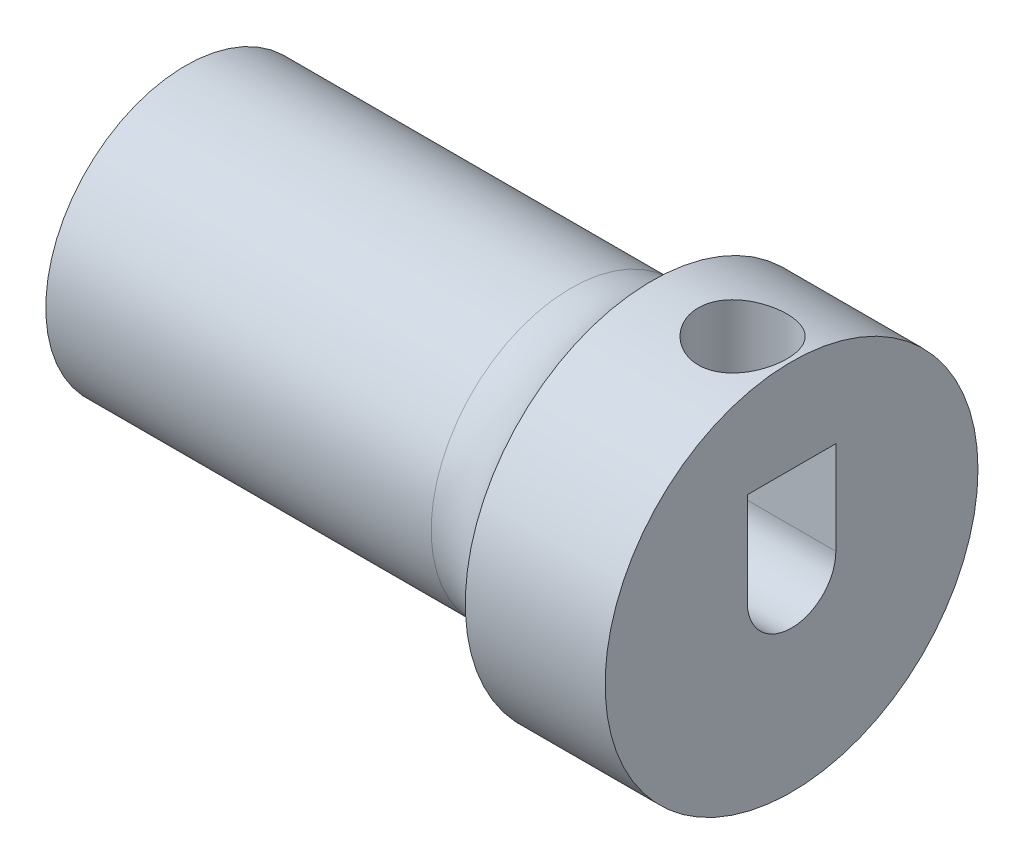
ISO-10303-21;
HEADER;
FILE_DESCRIPTION(('STEP AP214'),'2;1');
FILE_NAME('part.step','',(''),(''),'','','');
FILE_SCHEMA(('AUTOMOTIVE_DESIGN { 1 0 10303 214 1 1 1 1 }'));
ENDSEC;
DATA;
#1=APPLICATION_CONTEXT('core data for automotive mechanical design processes');
#2=APPLICATION_PROTOCOL_DEFINITION('international standard','automotive_design',2000,#1);
#3=PRODUCT_CONTEXT('',#1,'mechanical');
#4=PRODUCT('Part','Part','',(#3));
#5=PRODUCT_RELATED_PRODUCT_CATEGORY('part','',(#4));
#6=PRODUCT_DEFINITION_FORMATION('','',#4);
#7=PRODUCT_DEFINITION_CONTEXT('part definition',#1,'design');
#8=PRODUCT_DEFINITION('design','',#6,#7);
#9=PRODUCT_DEFINITION_SHAPE('','',#8);
#10=(LENGTH_UNIT() NAMED_UNIT(*) SI_UNIT(.MILLI.,.METRE.));
#11=(NAMED_UNIT(*) PLANE_ANGLE_UNIT() SI_UNIT($,.RADIAN.));
#12=(NAMED_UNIT(*) SI_UNIT($,.STERADIAN.) SOLID_ANGLE_UNIT());
#13=UNCERTAINTY_MEASURE_WITH_UNIT(LENGTH_MEASURE(1.E-05),#10,'distance_accuracy_value','');
#14=(GEOMETRIC_REPRESENTATION_CONTEXT(3) GLOBAL_UNCERTAINTY_ASSIGNED_CONTEXT((#13)) GLOBAL_UNIT_ASSIGNED_CONTEXT((#10,
#11,#12)) REPRESENTATION_CONTEXT('',''));
#15=CARTESIAN_POINT('',(0.,0.,0.));
#16=DIRECTION('',(0.,0.,1.));
#17=DIRECTION('',(1.,0.,0.));
#18=AXIS2_PLACEMENT_3D('',#15,#16,#17);
#19=CARTESIAN_POINT('',(11.,2.,0.));
#20=DIRECTION('',(0.,-1.,0.));
#21=DIRECTION('',(0.,0.,-1.));
#22=AXIS2_PLACEMENT_3D('',#19,#20,#21);
#23=PLANE('',#22);
#24=CARTESIAN_POINT('',(11.95,2.,0.));
#25=DIRECTION('',(0.,-1.,0.));
#26=DIRECTION('',(0.,0.,-1.));
#27=AXIS2_PLACEMENT_3D('',#24,#25,#26);
#28=CIRCLE('',#27,0.949999999999999);
#29=CARTESIAN_POINT('',(11.95,2.,-0.95));
#30=VERTEX_POINT('',#29);
#31=CARTESIAN_POINT('',(11.95,2.,0.949999999999999));
#32=VERTEX_POINT('',#31);
#33=EDGE_CURVE('E98',#30,#32,#28,.T.);
#34=ORIENTED_EDGE('',*,*,#33,.F.);
#35=DIRECTION('',(1.,0.,0.));
#36=VECTOR('',#35,1.);
#37=CARTESIAN_POINT('',(11.,2.,-0.95));
#38=LINE('',#37,#36);
#39=CARTESIAN_POINT('',(13.,2.,-0.95));
#40=VERTEX_POINT('',#39);
#41=EDGE_CURVE('E107',#30,#40,#38,.T.);
#42=ORIENTED_EDGE('',*,*,#41,.T.);
#43=DIRECTION('',(0.,0.,-1.));
#44=VECTOR('',#43,1.);
#45=CARTESIAN_POINT('',(13.,2.,0.));
#46=LINE('',#45,#44);
#47=CARTESIAN_POINT('',(13.,2.,0.95));
#48=VERTEX_POINT('',#47);
#49=EDGE_CURVE('E237',#48,#40,#46,.T.);
#50=ORIENTED_EDGE('',*,*,#49,.F.);
#51=DIRECTION('',(1.,0.,0.));
#52=VECTOR('',#51,1.);
#53=CARTESIAN_POINT('',(11.,2.,0.95));
#54=LINE('',#53,#52);
#55=EDGE_CURVE('E109',#32,#48,#54,.T.);
#56=ORIENTED_EDGE('',*,*,#55,.F.);
#57=EDGE_LOOP('',(#34,#42,#50,#56));
#58=FACE_BOUND('',#57,.T.);
#59=ADVANCED_FACE('F35',(#58),#23,.T.);
#60=CARTESIAN_POINT('',(11.,2.,0.));
#61=VERTEX_POINT('',#60);
#62=EDGE_CURVE('E50',#32,#61,#28,.T.);
#63=ORIENTED_EDGE('',*,*,#62,.F.);
#64=CARTESIAN_POINT('',(11.,2.,0.95));
#65=VERTEX_POINT('',#64);
#66=EDGE_CURVE('E125',#65,#32,#54,.T.);
#67=ORIENTED_EDGE('',*,*,#66,.F.);
#68=DIRECTION('',(0.,0.,-1.));
#69=VECTOR('',#68,1.);
#70=CARTESIAN_POINT('',(11.,2.,0.));
#71=LINE('',#70,#69);
#72=EDGE_CURVE('E132',#65,#61,#71,.T.);
#73=ORIENTED_EDGE('',*,*,#72,.T.);
#74=EDGE_LOOP('',(#63,#67,#73));
#75=FACE_BOUND('',#74,.T.);
#76=ADVANCED_FACE('F180',(#75),#23,.T.);
#77=CARTESIAN_POINT('',(13.,0.,0.));
#78=DIRECTION('',(1.,0.,0.));
#79=DIRECTION('',(0.,0.,-1.));
#80=AXIS2_PLACEMENT_3D('',#77,#78,#79);
#81=PLANE('',#80);
#82=CARTESIAN_POINT('',(13.,0.,0.));
#83=DIRECTION('',(1.,0.,0.));
#84=DIRECTION('',(0.,0.,-1.));
#85=AXIS2_PLACEMENT_3D('',#82,#83,#84);
#86=CIRCLE('',#85,4.);
#87=CARTESIAN_POINT('',(13.,0.,-4.));
#88=VERTEX_POINT('',#87);
#89=EDGE_CURVE('E133',#88,#88,#86,.T.);
#90=ORIENTED_EDGE('',*,*,#89,.T.);
#91=EDGE_LOOP('',(#90));
#92=FACE_BOUND('',#91,.T.);
#93=CARTESIAN_POINT('',(13.,0.,0.));
#94=DIRECTION('',(1.,0.,0.));
#95=DIRECTION('',(0.,0.,-1.));
#96=AXIS2_PLACEMENT_3D('',#93,#94,#95);
#97=CIRCLE('',#96,0.95);
#98=CARTESIAN_POINT('',(13.,0.,0.95));
#99=VERTEX_POINT('',#98);
#100=CARTESIAN_POINT('',(13.,0.,-0.95));
#101=VERTEX_POINT('',#100);
#102=EDGE_CURVE('E245',#99,#101,#97,.T.);
#103=ORIENTED_EDGE('',*,*,#102,.F.);
#104=DIRECTION('',(0.,1.,0.));
#105=VECTOR('',#104,1.);
#106=CARTESIAN_POINT('',(13.,0.,0.95));
#107=LINE('',#106,#105);
#108=EDGE_CURVE('E58',#99,#48,#107,.T.);
#109=ORIENTED_EDGE('',*,*,#108,.T.);
#110=ORIENTED_EDGE('',*,*,#49,.T.);
#111=DIRECTION('',(0.,1.,0.));
#112=VECTOR('',#111,1.);
#113=CARTESIAN_POINT('',(13.,0.,-0.95));
#114=LINE('',#113,#112);
#115=EDGE_CURVE('E119',#101,#40,#114,.T.);
#116=ORIENTED_EDGE('',*,*,#115,.F.);
#117=EDGE_LOOP('',(#103,#109,#110,#116));
#118=FACE_BOUND('',#117,.T.);
#119=ADVANCED_FACE('F185',(#92,#118),#81,.T.);
#120=CARTESIAN_POINT('',(10.,1.5,0.));
#121=DIRECTION('',(0.,1.,0.));
#122=DIRECTION('',(0.,0.,1.));
#123=AXIS2_PLACEMENT_3D('',#120,#121,#122);
#124=PLANE('',#123);
#125=DIRECTION('',(0.,0.,-1.));
#126=VECTOR('',#125,1.);
#127=CARTESIAN_POINT('',(0.,1.5,0.));
#128=LINE('',#127,#126);
#129=CARTESIAN_POINT('',(0.,1.5,1.3228756555323));
#130=VERTEX_POINT('',#129);
#131=CARTESIAN_POINT('',(0.,1.5,-1.3228756555323));
#132=VERTEX_POINT('',#131);
#133=EDGE_CURVE('E136',#130,#132,#128,.T.);
#134=ORIENTED_EDGE('',*,*,#133,.T.);
#135=DIRECTION('',(-1.,0.,0.));
#136=VECTOR('',#135,1.);
#137=CARTESIAN_POINT('',(10.,1.5,-1.3228756555323));
#138=LINE('',#137,#136);
#139=CARTESIAN_POINT('',(10.,1.5,-1.3228756555323));
#140=VERTEX_POINT('',#139);
#141=EDGE_CURVE('E43',#140,#132,#138,.T.);
#142=ORIENTED_EDGE('',*,*,#141,.F.);
#143=DIRECTION('',(0.,0.,-1.));
#144=VECTOR('',#143,1.);
#145=CARTESIAN_POINT('',(10.,1.5,0.));
#146=LINE('',#145,#144);
#147=CARTESIAN_POINT('',(10.,1.5,1.3228756555323));
#148=VERTEX_POINT('',#147);
#149=EDGE_CURVE('E140',#148,#140,#146,.T.);
#150=ORIENTED_EDGE('',*,*,#149,.F.);
#151=DIRECTION('',(-1.,0.,0.));
#152=VECTOR('',#151,1.);
#153=CARTESIAN_POINT('',(10.,1.5,1.3228756555323));
#154=LINE('',#153,#152);
#155=EDGE_CURVE('E146',#148,#130,#154,.T.);
#156=ORIENTED_EDGE('',*,*,#155,.T.);
#157=EDGE_LOOP('',(#134,#142,#150,#156));
#158=FACE_BOUND('',#157,.T.);
#159=ADVANCED_FACE('F162',(#158),#124,.F.);
#160=CARTESIAN_POINT('',(10.,0.,0.));
#161=DIRECTION('',(-1.,0.,0.));
#162=DIRECTION('',(0.,0.,1.));
#163=AXIS2_PLACEMENT_3D('',#160,#161,#162);
#164=CYLINDRICAL_SURFACE('',#163,2.);
#165=CARTESIAN_POINT('',(0.,0.,0.));
#166=DIRECTION('',(1.,0.,0.));
#167=DIRECTION('',(0.,0.,-1.));
#168=AXIS2_PLACEMENT_3D('',#165,#166,#167);
#169=CIRCLE('',#168,2.);
#170=EDGE_CURVE('E149',#130,#132,#169,.T.);
#171=ORIENTED_EDGE('',*,*,#170,.F.);
#172=ORIENTED_EDGE('',*,*,#155,.F.);
#173=CARTESIAN_POINT('',(10.,0.,0.));
#174=DIRECTION('',(1.,0.,0.));
#175=DIRECTION('',(0.,0.,-1.));
#176=AXIS2_PLACEMENT_3D('',#173,#174,#175);
#177=CIRCLE('',#176,2.);
#178=EDGE_CURVE('E142',#148,#140,#177,.T.);
#179=ORIENTED_EDGE('',*,*,#178,.T.);
#180=ORIENTED_EDGE('',*,*,#141,.T.);
#181=EDGE_LOOP('',(#171,#172,#179,#180));
#182=FACE_BOUND('',#181,.T.);
#183=ADVANCED_FACE('F157',(#182),#164,.F.);
#184=CARTESIAN_POINT('',(10.,0.,0.));
#185=DIRECTION('',(-1.,0.,0.));
#186=DIRECTION('',(0.,0.,1.));
#187=AXIS2_PLACEMENT_3D('',#184,#185,#186);
#188=CYLINDRICAL_SURFACE('',#187,3.);
#189=CARTESIAN_POINT('',(8.26794919243113,0.,0.));
#190=DIRECTION('',(1.,0.,0.));
#191=DIRECTION('',(0.,0.,-1.));
#192=AXIS2_PLACEMENT_3D('',#189,#190,#191);
#193=CIRCLE('',#192,3.);
#194=CARTESIAN_POINT('',(8.26794919243113,0.,-3.));
#195=VERTEX_POINT('',#194);
#196=EDGE_CURVE('E11',#195,#195,#193,.F.);
#197=ORIENTED_EDGE('',*,*,#196,.T.);
#198=EDGE_LOOP('',(#197));
#199=FACE_BOUND('',#198,.T.);
#200=CARTESIAN_POINT('',(0.,0.,0.));
#201=DIRECTION('',(1.,0.,0.));
#202=DIRECTION('',(0.,0.,-1.));
#203=AXIS2_PLACEMENT_3D('',#200,#201,#202);
#204=CIRCLE('',#203,3.);
#205=CARTESIAN_POINT('',(0.,0.,-3.));
#206=VERTEX_POINT('',#205);
#207=EDGE_CURVE('E143',#206,#206,#204,.T.);
#208=ORIENTED_EDGE('',*,*,#207,.T.);
#209=EDGE_LOOP('',(#208));
#210=FACE_BOUND('',#209,.T.);
#211=ADVANCED_FACE('F168',(#199,#210),#188,.T.);
#212=CARTESIAN_POINT('',(0.,0.,0.));
#213=DIRECTION('',(1.,0.,0.));
#214=DIRECTION('',(0.,0.,-1.));
#215=AXIS2_PLACEMENT_3D('',#212,#213,#214);
#216=PLANE('',#215);
#217=ORIENTED_EDGE('',*,*,#133,.F.);
#218=ORIENTED_EDGE('',*,*,#170,.T.);
#219=EDGE_LOOP('',(#217,#218));
#220=FACE_BOUND('',#219,.T.);
#221=ORIENTED_EDGE('',*,*,#207,.F.);
#222=EDGE_LOOP('',(#221));
#223=FACE_BOUND('',#222,.T.);
#224=ADVANCED_FACE('F164',(#220,#223),#216,.F.);
#225=CARTESIAN_POINT('',(13.,0.,0.));
#226=DIRECTION('',(-1.,0.,0.));
#227=DIRECTION('',(0.,0.,1.));
#228=AXIS2_PLACEMENT_3D('',#225,#226,#227);
#229=CYLINDRICAL_SURFACE('',#228,4.);
#230=CARTESIAN_POINT('',(11.,4.,0.));
#231=CARTESIAN_POINT('',(11.0000016183299,3.99999906469199,-0.0525716159169858));
#232=CARTESIAN_POINT('',(11.0043785612979,3.99895317185943,-0.10516189139282));
#233=CARTESIAN_POINT('',(11.0217478183878,3.99488209966177,-0.208840750015937));
#234=CARTESIAN_POINT('',(11.0347455423577,3.99185567745966,-0.259928369155543));
#235=CARTESIAN_POINT('',(11.0689200816207,3.98415944205558,-0.359089250491862));
#236=CARTESIAN_POINT('',(11.0900875991039,3.97949149755827,-0.40716586739361));
#237=CARTESIAN_POINT('',(11.1399694429263,3.96901210268168,-0.499084935171157));
#238=CARTESIAN_POINT('',(11.1686838408537,3.96320064145538,-0.5429273458768));
#239=CARTESIAN_POINT('',(11.2334126437165,3.95094585351953,-0.625954950183176));
#240=CARTESIAN_POINT('',(11.2695415622915,3.9444935532216,-0.665049549864636));
#241=CARTESIAN_POINT('',(11.3478283880206,3.93174538714891,-0.736685145331751));
#242=CARTESIAN_POINT('',(11.3899869127154,3.92544953747514,-0.769225469017967));
#243=CARTESIAN_POINT('',(11.4798257134653,3.91363751271594,-0.827243901664241));
#244=CARTESIAN_POINT('',(11.527571762652,3.90813277607999,-0.852622702939507));
#245=CARTESIAN_POINT('',(11.6268039188517,3.89865629675525,-0.894959734593699));
#246=CARTESIAN_POINT('',(11.6782894902289,3.89468433502972,-0.911919168217191));
#247=CARTESIAN_POINT('',(11.7825484299503,3.88881502948517,-0.936630976667309));
#248=CARTESIAN_POINT('',(11.8352813318916,3.88688125891104,-0.944545232811815));
#249=CARTESIAN_POINT('',(11.9413591159456,3.88519810196589,-0.951445911981742));
#250=CARTESIAN_POINT('',(11.994703907598,3.88544839676076,-0.950433638119197));
#251=CARTESIAN_POINT('',(12.0992662189462,3.88807224775455,-0.939639609917526));
#252=CARTESIAN_POINT('',(12.1505047791938,3.89039959182489,-0.93004871048316));
#253=CARTESIAN_POINT('',(12.2506240834027,3.89684190578202,-0.902673271472566));
#254=CARTESIAN_POINT('',(12.2995046738496,3.90095699188486,-0.8848881992118));
#255=CARTESIAN_POINT('',(12.3940424967946,3.9105548253172,-0.841461453464165));
#256=CARTESIAN_POINT('',(12.4396658344275,3.91604983900591,-0.81574881704649));
#257=CARTESIAN_POINT('',(12.5260196412209,3.9277812104864,-0.757246563518833));
#258=CARTESIAN_POINT('',(12.5667493301915,3.93401768617427,-0.72445582027735));
#259=CARTESIAN_POINT('',(12.6432555764764,3.94672541410529,-0.651730542122147));
#260=CARTESIAN_POINT('',(12.6788783912255,3.95319858648444,-0.611634422022609));
#261=CARTESIAN_POINT('',(12.7429218248061,3.96550559399558,-0.525961333282165));
#262=CARTESIAN_POINT('',(12.7713422637796,3.97133941315954,-0.480384227811709));
#263=CARTESIAN_POINT('',(12.8202228823539,3.98173500028595,-0.384836770537653));
#264=CARTESIAN_POINT('',(12.840660098404,3.98629308813007,-0.334854244791349));
#265=CARTESIAN_POINT('',(12.8728008972482,3.99359668454635,-0.23203129714189));
#266=CARTESIAN_POINT('',(12.8845059834716,3.99634250513101,-0.179191368884722));
#267=CARTESIAN_POINT('',(12.8986201150301,3.99966674218909,-0.0734697740868866));
#268=CARTESIAN_POINT('',(12.9012387859827,4.00029402456828,-0.0206175898746313));
#269=CARTESIAN_POINT('',(12.8976778910846,3.99944875545038,0.0847693912894502));
#270=CARTESIAN_POINT('',(12.8914990353755,3.99797637343947,0.137304213515182));
#271=CARTESIAN_POINT('',(12.870691759218,3.99312833707979,0.239850803389257));
#272=CARTESIAN_POINT('',(12.856175873319,3.98977804526624,0.289886711620185));
#273=CARTESIAN_POINT('',(12.8192336186693,3.98155050554334,0.386811992305044));
#274=CARTESIAN_POINT('',(12.7968064988888,3.97667311266811,0.433701065520283));
#275=CARTESIAN_POINT('',(12.7442595778896,3.96581376248466,0.523849378276179));
#276=CARTESIAN_POINT('',(12.7140199803692,3.95981504718028,0.567036723487755));
#277=CARTESIAN_POINT('',(12.6468614949237,3.94740789681519,0.647798786117558));
#278=CARTESIAN_POINT('',(12.609941572896,3.94099939842023,0.685372632929672));
#279=CARTESIAN_POINT('',(12.5295014573836,3.92832194607314,0.754690657932369));
#280=CARTESIAN_POINT('',(12.4858540017446,3.92205915749654,0.786288509801899));
#281=CARTESIAN_POINT('',(12.3937506057482,3.91054099753535,0.84170866864317));
#282=CARTESIAN_POINT('',(12.3452948807027,3.90528558107201,0.865531323579623));
#283=CARTESIAN_POINT('',(12.2452149112979,3.89643241208044,0.904552385519316));
#284=CARTESIAN_POINT('',(12.1936113450521,3.89282493569091,0.919801508214677));
#285=CARTESIAN_POINT('',(12.0884755974806,3.88766286660848,0.941383482274677));
#286=CARTESIAN_POINT('',(12.0349437917225,3.88610787634571,0.947718060416689));
#287=CARTESIAN_POINT('',(11.9289541999693,3.88525500882718,0.951207673286702));
#288=CARTESIAN_POINT('',(11.8765044183748,3.88589982858001,0.948595748816156));
#289=CARTESIAN_POINT('',(11.7728158279898,3.88924263620545,0.934794720821821));
#290=CARTESIAN_POINT('',(11.7215769993034,3.89194059032116,0.923605758318629));
#291=CARTESIAN_POINT('',(11.6219898706991,3.89905535379612,0.893089656089785));
#292=CARTESIAN_POINT('',(11.5736287775948,3.90346377826989,0.8738021787098));
#293=CARTESIAN_POINT('',(11.4807964000663,3.91350473785678,0.827668720259458));
#294=CARTESIAN_POINT('',(11.4363256023956,3.91913742584329,0.800821795119377));
#295=CARTESIAN_POINT('',(11.3514005131673,3.93115888085215,0.739583444580447));
#296=CARTESIAN_POINT('',(11.3110662202134,3.93756238942864,0.705028469753711));
#297=CARTESIAN_POINT('',(11.2366926863944,3.95031159366473,0.62967899839312));
#298=CARTESIAN_POINT('',(11.2026549225039,3.95665727542887,0.588883042004165));
#299=CARTESIAN_POINT('',(11.1413163819867,3.96869602920727,0.501426734883566));
#300=CARTESIAN_POINT('',(11.1141313663857,3.97437711633985,0.454683431807124));
#301=CARTESIAN_POINT('',(11.0680481601686,3.98432297774674,0.357161890174495));
#302=CARTESIAN_POINT('',(11.0491436045693,3.98858883925562,0.306386786355228));
#303=CARTESIAN_POINT('',(11.0232005814359,3.99453812005878,0.213033333424223));
#304=CARTESIAN_POINT('',(11.0145182262592,3.9965728416634,0.170926491446312));
#305=CARTESIAN_POINT('',(11.0029174504572,3.99930412283102,0.0858838835983427));
#306=CARTESIAN_POINT('',(10.999998677912,4.00000076409609,0.0429481685002916));
#307=CARTESIAN_POINT('',(11.,4.,0.));
#308=B_SPLINE_CURVE_WITH_KNOTS('',3,(#230,#231,#232,#233,#234,#235,#236,#237,#238,#239,#240,
#241,#242,#243,#244,#245,#246,#247,#248,#249,#250,#251,#252,#253,#254,#255,#256,#257,#258,#259,
#260,#261,#262,#263,#264,#265,#266,#267,#268,#269,#270,#271,#272,#273,#274,#275,#276,#277,#278,
#279,#280,#281,#282,#283,#284,#285,#286,#287,#288,#289,#290,#291,#292,#293,#294,#295,#296,#297,
#298,#299,#300,#301,#302,#303,#304,#305,#306,#307),.UNSPECIFIED.,.T.,.F.,(4,2,2,2,2,2,2,2,2,2,2,
2,2,2,2,2,2,2,2,2,2,2,2,2,2,2,2,2,2,2,2,2,2,2,2,2,2,2,4),(0.,0.157557535642248,
0.315214037931965,0.472691642396623,0.630170740713635,0.790294937874519,0.950435546406421,
1.11269843184274,1.27493812097866,1.43422636061928,1.59349134744105,1.74929882919631,
1.90511644107104,2.06237145603623,2.21965150884402,2.38096351149933,2.54227954204941,
2.70405623620996,2.86580507050254,3.02379657108821,3.18177531922635,3.33767014759884,
3.49357977937187,3.65203889731465,3.81052256547087,3.97249049929225,4.13445118354089,
4.29544344782794,4.45640452307555,4.61320507252327,4.77000304396765,4.92604189533596,
5.08210024243282,5.24185280413888,5.40164279156039,5.56397421305201,5.72618063450725,
5.85490448453998,5.98362047455138),.UNSPECIFIED.);
#309=CARTESIAN_POINT('',(11.,4.,0.));
#310=VERTEX_POINT('',#309);
#311=EDGE_CURVE('E111',#310,#310,#308,.T.);
#312=ORIENTED_EDGE('',*,*,#311,.T.);
#313=EDGE_LOOP('',(#312));
#314=FACE_BOUND('',#313,.T.);
#315=ORIENTED_EDGE('',*,*,#89,.F.);
#316=EDGE_LOOP('',(#315));
#317=FACE_BOUND('',#316,.T.);
#318=CARTESIAN_POINT('',(10.,0.,0.));
#319=DIRECTION('',(1.,0.,0.));
#320=DIRECTION('',(0.,0.,-1.));
#321=AXIS2_PLACEMENT_3D('',#318,#319,#320);
#322=CIRCLE('',#321,4.);
#323=CARTESIAN_POINT('',(10.,0.,-4.));
#324=VERTEX_POINT('',#323);
#325=EDGE_CURVE('E137',#324,#324,#322,.T.);
#326=ORIENTED_EDGE('',*,*,#325,.T.);
#327=EDGE_LOOP('',(#326));
#328=FACE_BOUND('',#327,.T.);
#329=ADVANCED_FACE('F167',(#314,#317,#328),#229,.T.);
#330=CARTESIAN_POINT('',(10.,0.,0.));
#331=DIRECTION('',(1.,0.,0.));
#332=DIRECTION('',(0.,0.,-1.));
#333=AXIS2_PLACEMENT_3D('',#330,#331,#332);
#334=PLANE('',#333);
#335=ORIENTED_EDGE('',*,*,#178,.F.);
#336=ORIENTED_EDGE('',*,*,#149,.T.);
#337=EDGE_LOOP('',(#335,#336));
#338=FACE_BOUND('',#337,.T.);
#339=ADVANCED_FACE('F200',(#338),#334,.F.);
#340=CARTESIAN_POINT('',(8.26794919243113,0.,0.));
#341=DIRECTION('',(1.,0.,0.));
#342=DIRECTION('',(0.,0.,-1.));
#343=AXIS2_PLACEMENT_3D('',#340,#341,#342);
#344=TOROIDAL_SURFACE('',#343,5.,2.);
#345=ORIENTED_EDGE('',*,*,#196,.F.);
#346=EDGE_LOOP('',(#345));
#347=FACE_BOUND('',#346,.T.);
#348=ORIENTED_EDGE('',*,*,#325,.F.);
#349=EDGE_LOOP('',(#348));
#350=FACE_BOUND('',#349,.T.);
#351=ADVANCED_FACE('F37',(#347,#350),#344,.F.);
#352=CARTESIAN_POINT('',(11.,0.,0.95));
#353=DIRECTION('',(0.,0.,-1.));
#354=DIRECTION('',(-1.,0.,0.));
#355=AXIS2_PLACEMENT_3D('',#352,#353,#354);
#356=PLANE('',#355);
#357=ORIENTED_EDGE('',*,*,#108,.F.);
#358=DIRECTION('',(1.,0.,0.));
#359=VECTOR('',#358,1.);
#360=CARTESIAN_POINT('',(11.,0.,0.95));
#361=LINE('',#360,#359);
#362=CARTESIAN_POINT('',(11.,0.,0.95));
#363=VERTEX_POINT('',#362);
#364=EDGE_CURVE('E130',#363,#99,#361,.T.);
#365=ORIENTED_EDGE('',*,*,#364,.F.);
#366=DIRECTION('',(0.,1.,0.));
#367=VECTOR('',#366,1.);
#368=CARTESIAN_POINT('',(11.,0.,0.95));
#369=LINE('',#368,#367);
#370=EDGE_CURVE('E219',#363,#65,#369,.T.);
#371=ORIENTED_EDGE('',*,*,#370,.T.);
#372=ORIENTED_EDGE('',*,*,#66,.T.);
#373=ORIENTED_EDGE('',*,*,#55,.T.);
#374=EDGE_LOOP('',(#357,#365,#371,#372,#373));
#375=FACE_BOUND('',#374,.T.);
#376=ADVANCED_FACE('F190',(#375),#356,.T.);
#377=EDGE_CURVE('E94',#61,#30,#28,.T.);
#378=ORIENTED_EDGE('',*,*,#377,.F.);
#379=CARTESIAN_POINT('',(11.,2.,-0.95));
#380=VERTEX_POINT('',#379);
#381=EDGE_CURVE('E124',#61,#380,#71,.T.);
#382=ORIENTED_EDGE('',*,*,#381,.T.);
#383=EDGE_CURVE('E116',#380,#30,#38,.T.);
#384=ORIENTED_EDGE('',*,*,#383,.T.);
#385=EDGE_LOOP('',(#378,#382,#384));
#386=FACE_BOUND('',#385,.T.);
#387=ADVANCED_FACE('F123',(#386),#23,.T.);
#388=CARTESIAN_POINT('',(11.,0.,-0.95));
#389=DIRECTION('',(0.,0.,-1.));
#390=DIRECTION('',(-1.,0.,0.));
#391=AXIS2_PLACEMENT_3D('',#388,#389,#390);
#392=PLANE('',#391);
#393=ORIENTED_EDGE('',*,*,#115,.T.);
#394=ORIENTED_EDGE('',*,*,#41,.F.);
#395=ORIENTED_EDGE('',*,*,#383,.F.);
#396=DIRECTION('',(0.,1.,0.));
#397=VECTOR('',#396,1.);
#398=CARTESIAN_POINT('',(11.,0.,-0.95));
#399=LINE('',#398,#397);
#400=CARTESIAN_POINT('',(11.,0.,-0.95));
#401=VERTEX_POINT('',#400);
#402=EDGE_CURVE('E240',#401,#380,#399,.T.);
#403=ORIENTED_EDGE('',*,*,#402,.F.);
#404=DIRECTION('',(1.,0.,0.));
#405=VECTOR('',#404,1.);
#406=CARTESIAN_POINT('',(11.,0.,-0.95));
#407=LINE('',#406,#405);
#408=EDGE_CURVE('E121',#401,#101,#407,.T.);
#409=ORIENTED_EDGE('',*,*,#408,.T.);
#410=EDGE_LOOP('',(#393,#394,#395,#403,#409));
#411=FACE_BOUND('',#410,.T.);
#412=ADVANCED_FACE('F114',(#411),#392,.F.);
#413=CARTESIAN_POINT('',(11.,0.,0.));
#414=DIRECTION('',(1.,0.,0.));
#415=DIRECTION('',(0.,0.,-1.));
#416=AXIS2_PLACEMENT_3D('',#413,#414,#415);
#417=CYLINDRICAL_SURFACE('',#416,0.95);
#418=ORIENTED_EDGE('',*,*,#102,.T.);
#419=ORIENTED_EDGE('',*,*,#408,.F.);
#420=CARTESIAN_POINT('',(11.,0.,0.));
#421=DIRECTION('',(1.,0.,0.));
#422=DIRECTION('',(0.,0.,-1.));
#423=AXIS2_PLACEMENT_3D('',#420,#421,#422);
#424=CIRCLE('',#423,0.95);
#425=EDGE_CURVE('E234',#363,#401,#424,.T.);
#426=ORIENTED_EDGE('',*,*,#425,.F.);
#427=ORIENTED_EDGE('',*,*,#364,.T.);
#428=EDGE_LOOP('',(#418,#419,#426,#427));
#429=FACE_BOUND('',#428,.T.);
#430=ADVANCED_FACE('F195',(#429),#417,.F.);
#431=CARTESIAN_POINT('',(11.,0.,0.));
#432=DIRECTION('',(1.,0.,0.));
#433=DIRECTION('',(0.,0.,-1.));
#434=AXIS2_PLACEMENT_3D('',#431,#432,#433);
#435=PLANE('',#434);
#436=ORIENTED_EDGE('',*,*,#370,.F.);
#437=ORIENTED_EDGE('',*,*,#425,.T.);
#438=ORIENTED_EDGE('',*,*,#402,.T.);
#439=ORIENTED_EDGE('',*,*,#381,.F.);
#440=ORIENTED_EDGE('',*,*,#72,.F.);
#441=EDGE_LOOP('',(#436,#437,#438,#439,#440));
#442=FACE_BOUND('',#441,.T.);
#443=ADVANCED_FACE('F223',(#442),#435,.T.);
#444=CARTESIAN_POINT('',(11.95,4.,0.));
#445=DIRECTION('',(0.,-1.,0.));
#446=DIRECTION('',(0.,0.,-1.));
#447=AXIS2_PLACEMENT_3D('',#444,#445,#446);
#448=CYLINDRICAL_SURFACE('',#447,0.949999999999999);
#449=ORIENTED_EDGE('',*,*,#33,.T.);
#450=ORIENTED_EDGE('',*,*,#62,.T.);
#451=ORIENTED_EDGE('',*,*,#377,.T.);
#452=EDGE_LOOP('',(#449,#450,#451));
#453=FACE_BOUND('',#452,.T.);
#454=ORIENTED_EDGE('',*,*,#311,.F.);
#455=EDGE_LOOP('',(#454));
#456=FACE_BOUND('',#455,.T.);
#457=ADVANCED_FACE('F96',(#453,#456),#448,.F.);
#458=CLOSED_SHELL('',(#59,#76,#119,#159,#183,#211,#224,#329,#339,#351,#376,#387,#412,#430,#443,#457));
#459=MANIFOLD_SOLID_BREP('B2',#458);
#460=ADVANCED_BREP_SHAPE_REPRESENTATION('',(#18,#459),#14);
#461=SHAPE_DEFINITION_REPRESENTATION(#9,#460);
ENDSEC;
END-ISO-10303-21;
